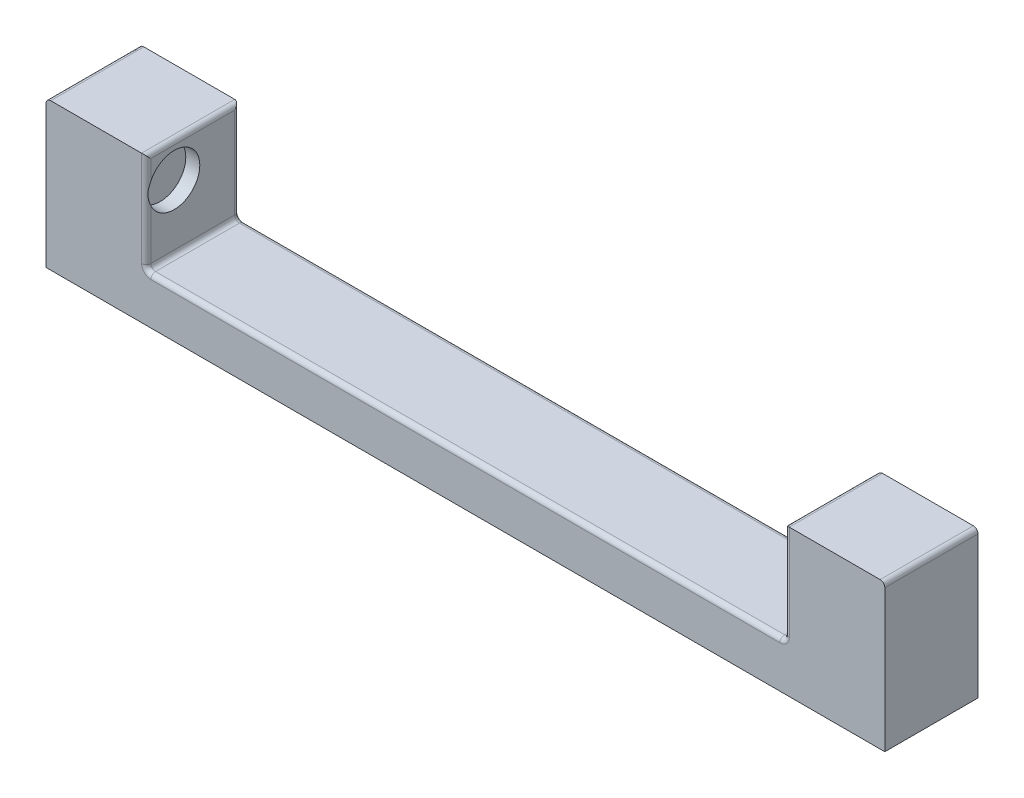
ISO-10303-21;
HEADER;
FILE_DESCRIPTION(('STEP AP214'),'2;1');
FILE_NAME('part.step','',(''),(''),'','','');
FILE_SCHEMA(('AUTOMOTIVE_DESIGN { 1 0 10303 214 1 1 1 1 }'));
ENDSEC;
DATA;
#1=APPLICATION_CONTEXT('core data for automotive mechanical design processes');
#2=APPLICATION_PROTOCOL_DEFINITION('international standard','automotive_design',2000,#1);
#3=PRODUCT_CONTEXT('',#1,'mechanical');
#4=PRODUCT('Part','Part','',(#3));
#5=PRODUCT_RELATED_PRODUCT_CATEGORY('part','',(#4));
#6=PRODUCT_DEFINITION_FORMATION('','',#4);
#7=PRODUCT_DEFINITION_CONTEXT('part definition',#1,'design');
#8=PRODUCT_DEFINITION('design','',#6,#7);
#9=PRODUCT_DEFINITION_SHAPE('','',#8);
#10=(LENGTH_UNIT() NAMED_UNIT(*) SI_UNIT(.MILLI.,.METRE.));
#11=(NAMED_UNIT(*) PLANE_ANGLE_UNIT() SI_UNIT($,.RADIAN.));
#12=(NAMED_UNIT(*) SI_UNIT($,.STERADIAN.) SOLID_ANGLE_UNIT());
#13=UNCERTAINTY_MEASURE_WITH_UNIT(LENGTH_MEASURE(1.E-05),#10,'distance_accuracy_value','');
#14=(GEOMETRIC_REPRESENTATION_CONTEXT(3) GLOBAL_UNCERTAINTY_ASSIGNED_CONTEXT((#13)) GLOBAL_UNIT_ASSIGNED_CONTEXT((#10,
#11,#12)) REPRESENTATION_CONTEXT('',''));
#15=CARTESIAN_POINT('',(0.,0.,0.));
#16=DIRECTION('',(0.,0.,1.));
#17=DIRECTION('',(1.,0.,0.));
#18=AXIS2_PLACEMENT_3D('',#15,#16,#17);
#19=CARTESIAN_POINT('',(0.,0.,0.));
#20=DIRECTION('',(0.,-1.,0.));
#21=DIRECTION('',(1.,0.,0.));
#22=AXIS2_PLACEMENT_3D('',#19,#20,#21);
#23=PLANE('',#22);
#24=DIRECTION('',(-1.,0.,0.));
#25=VECTOR('',#24,1.);
#26=CARTESIAN_POINT('',(0.,0.,9.5));
#27=LINE('',#26,#25);
#28=CARTESIAN_POINT('',(-33.75,0.,9.5));
#29=VERTEX_POINT('',#28);
#30=CARTESIAN_POINT('',(33.75,0.,9.5));
#31=VERTEX_POINT('',#30);
#32=EDGE_CURVE('E56',#29,#31,#27,.F.);
#33=ORIENTED_EDGE('',*,*,#32,.T.);
#34=DIRECTION('',(0.,0.,-1.));
#35=VECTOR('',#34,1.);
#36=CARTESIAN_POINT('',(33.75,0.,0.));
#37=LINE('',#36,#35);
#38=CARTESIAN_POINT('',(33.75,0.,0.5));
#39=VERTEX_POINT('',#38);
#40=EDGE_CURVE('E51',#31,#39,#37,.T.);
#41=ORIENTED_EDGE('',*,*,#40,.T.);
#42=DIRECTION('',(1.,0.,0.));
#43=VECTOR('',#42,1.);
#44=CARTESIAN_POINT('',(-34.25,0.,0.5));
#45=LINE('',#44,#43);
#46=CARTESIAN_POINT('',(-33.75,0.,0.5));
#47=VERTEX_POINT('',#46);
#48=EDGE_CURVE('E448',#39,#47,#45,.F.);
#49=ORIENTED_EDGE('',*,*,#48,.T.);
#50=DIRECTION('',(0.,0.,-1.));
#51=VECTOR('',#50,1.);
#52=CARTESIAN_POINT('',(-33.75,0.,10.));
#53=LINE('',#52,#51);
#54=EDGE_CURVE('E450',#47,#29,#53,.F.);
#55=ORIENTED_EDGE('',*,*,#54,.T.);
#56=EDGE_LOOP('',(#33,#41,#49,#55));
#57=FACE_BOUND('',#56,.T.);
#58=ADVANCED_FACE('F34',(#57),#23,.F.);
#59=CARTESIAN_POINT('',(-34.25,10.75,10.));
#60=DIRECTION('',(-1.,0.,0.));
#61=DIRECTION('',(0.,0.,1.));
#62=AXIS2_PLACEMENT_3D('',#59,#60,#61);
#63=PLANE('',#62);
#64=DIRECTION('',(0.,0.,-1.));
#65=VECTOR('',#64,1.);
#66=CARTESIAN_POINT('',(-34.25,10.25,10.));
#67=LINE('',#66,#65);
#68=CARTESIAN_POINT('',(-34.25,10.25,0.5));
#69=VERTEX_POINT('',#68);
#70=CARTESIAN_POINT('',(-34.25,10.25,9.5));
#71=VERTEX_POINT('',#70);
#72=EDGE_CURVE('E225',#69,#71,#67,.F.);
#73=ORIENTED_EDGE('',*,*,#72,.T.);
#74=DIRECTION('',(0.,1.,0.));
#75=VECTOR('',#74,1.);
#76=CARTESIAN_POINT('',(-34.25,10.75,9.5));
#77=LINE('',#76,#75);
#78=CARTESIAN_POINT('',(-34.25,8.14564392373896,9.5));
#79=VERTEX_POINT('',#78);
#80=EDGE_CURVE('E227',#71,#79,#77,.F.);
#81=ORIENTED_EDGE('',*,*,#80,.T.);
#82=CARTESIAN_POINT('',(-34.25,7.,7.));
#83=DIRECTION('',(1.,0.,0.));
#84=DIRECTION('',(0.,0.,-1.));
#85=AXIS2_PLACEMENT_3D('',#82,#83,#84);
#86=CIRCLE('',#85,2.75);
#87=CARTESIAN_POINT('',(-34.25,5.85435607626104,9.5));
#88=VERTEX_POINT('',#87);
#89=EDGE_CURVE('E457',#88,#79,#86,.T.);
#90=ORIENTED_EDGE('',*,*,#89,.F.);
#91=DIRECTION('',(0.,1.,0.));
#92=VECTOR('',#91,1.);
#93=CARTESIAN_POINT('',(-34.25,10.75,9.5));
#94=LINE('',#93,#92);
#95=CARTESIAN_POINT('',(-34.25,0.499999999999997,9.5));
#96=VERTEX_POINT('',#95);
#97=EDGE_CURVE('E220',#88,#96,#94,.F.);
#98=ORIENTED_EDGE('',*,*,#97,.T.);
#99=DIRECTION('',(0.,0.,-1.));
#100=VECTOR('',#99,1.);
#101=CARTESIAN_POINT('',(-34.25,0.499999999999997,0.));
#102=LINE('',#101,#100);
#103=CARTESIAN_POINT('',(-34.25,0.499999999999997,0.5));
#104=VERTEX_POINT('',#103);
#105=EDGE_CURVE('E216',#96,#104,#102,.T.);
#106=ORIENTED_EDGE('',*,*,#105,.T.);
#107=DIRECTION('',(0.,1.,0.));
#108=VECTOR('',#107,1.);
#109=CARTESIAN_POINT('',(-34.25,10.75,0.5));
#110=LINE('',#109,#108);
#111=EDGE_CURVE('E222',#104,#69,#110,.T.);
#112=ORIENTED_EDGE('',*,*,#111,.T.);
#113=EDGE_LOOP('',(#73,#81,#90,#98,#106,#112));
#114=FACE_BOUND('',#113,.T.);
#115=ADVANCED_FACE('F315',(#114),#63,.F.);
#116=CARTESIAN_POINT('',(-34.25,10.75,10.));
#117=DIRECTION('',(0.,-1.,0.));
#118=DIRECTION('',(1.,0.,0.));
#119=AXIS2_PLACEMENT_3D('',#116,#117,#118);
#120=PLANE('',#119);
#121=DIRECTION('',(-1.,0.,0.));
#122=VECTOR('',#121,1.);
#123=CARTESIAN_POINT('',(-34.25,10.75,0.));
#124=LINE('',#123,#122);
#125=CARTESIAN_POINT('',(-34.75,10.75,0.));
#126=VERTEX_POINT('',#125);
#127=CARTESIAN_POINT('',(-44.5,10.75,0.));
#128=VERTEX_POINT('',#127);
#129=EDGE_CURVE('E183',#126,#128,#124,.T.);
#130=ORIENTED_EDGE('',*,*,#129,.T.);
#131=DIRECTION('',(0.,0.,-1.));
#132=VECTOR('',#131,1.);
#133=CARTESIAN_POINT('',(-44.5,10.75,10.));
#134=LINE('',#133,#132);
#135=CARTESIAN_POINT('',(-44.5,10.75,10.));
#136=VERTEX_POINT('',#135);
#137=EDGE_CURVE('E11',#128,#136,#134,.F.);
#138=ORIENTED_EDGE('',*,*,#137,.T.);
#139=DIRECTION('',(-1.,0.,0.));
#140=VECTOR('',#139,1.);
#141=CARTESIAN_POINT('',(-34.25,10.75,10.));
#142=LINE('',#141,#140);
#143=CARTESIAN_POINT('',(-34.75,10.75,10.));
#144=VERTEX_POINT('',#143);
#145=EDGE_CURVE('E182',#144,#136,#142,.T.);
#146=ORIENTED_EDGE('',*,*,#145,.F.);
#147=DIRECTION('',(0.,0.,-1.));
#148=VECTOR('',#147,1.);
#149=CARTESIAN_POINT('',(-34.75,10.75,10.));
#150=LINE('',#149,#148);
#151=EDGE_CURVE('E43',#144,#126,#150,.T.);
#152=ORIENTED_EDGE('',*,*,#151,.T.);
#153=EDGE_LOOP('',(#130,#138,#146,#152));
#154=FACE_BOUND('',#153,.T.);
#155=ADVANCED_FACE('F320',(#154),#120,.F.);
#156=CARTESIAN_POINT('',(-45.,10.75,10.));
#157=DIRECTION('',(1.,0.,0.));
#158=DIRECTION('',(0.,0.,-1.));
#159=AXIS2_PLACEMENT_3D('',#156,#157,#158);
#160=PLANE('',#159);
#161=DIRECTION('',(0.,-1.,0.));
#162=VECTOR('',#161,1.);
#163=CARTESIAN_POINT('',(-45.,10.75,10.));
#164=LINE('',#163,#162);
#165=CARTESIAN_POINT('',(-45.,10.25,10.));
#166=VERTEX_POINT('',#165);
#167=CARTESIAN_POINT('',(-45.,-5.00000000000001,10.));
#168=VERTEX_POINT('',#167);
#169=EDGE_CURVE('E214',#166,#168,#164,.T.);
#170=ORIENTED_EDGE('',*,*,#169,.F.);
#171=DIRECTION('',(0.,0.,-1.));
#172=VECTOR('',#171,1.);
#173=CARTESIAN_POINT('',(-45.,10.25,10.));
#174=LINE('',#173,#172);
#175=CARTESIAN_POINT('',(-45.,10.25,0.));
#176=VERTEX_POINT('',#175);
#177=EDGE_CURVE('E180',#166,#176,#174,.T.);
#178=ORIENTED_EDGE('',*,*,#177,.T.);
#179=DIRECTION('',(0.,-1.,0.));
#180=VECTOR('',#179,1.);
#181=CARTESIAN_POINT('',(-45.,10.75,0.));
#182=LINE('',#181,#180);
#183=CARTESIAN_POINT('',(-45.,-5.00000000000001,0.));
#184=VERTEX_POINT('',#183);
#185=EDGE_CURVE('E173',#176,#184,#182,.T.);
#186=ORIENTED_EDGE('',*,*,#185,.T.);
#187=DIRECTION('',(0.,0.,-1.));
#188=VECTOR('',#187,1.);
#189=CARTESIAN_POINT('',(-45.,-5.00000000000001,10.));
#190=LINE('',#189,#188);
#191=EDGE_CURVE('E178',#168,#184,#190,.T.);
#192=ORIENTED_EDGE('',*,*,#191,.F.);
#193=EDGE_LOOP('',(#170,#178,#186,#192));
#194=FACE_BOUND('',#193,.T.);
#195=ADVANCED_FACE('F176',(#194),#160,.F.);
#196=CARTESIAN_POINT('',(0.,0.,10.));
#197=DIRECTION('',(0.,0.,-1.));
#198=DIRECTION('',(-1.,0.,0.));
#199=AXIS2_PLACEMENT_3D('',#196,#197,#198);
#200=PLANE('',#199);
#201=DIRECTION('',(-1.,0.,0.));
#202=VECTOR('',#201,1.);
#203=CARTESIAN_POINT('',(34.25,10.75,10.));
#204=LINE('',#203,#202);
#205=CARTESIAN_POINT('',(44.5,10.75,10.));
#206=VERTEX_POINT('',#205);
#207=CARTESIAN_POINT('',(34.75,10.75,10.));
#208=VERTEX_POINT('',#207);
#209=EDGE_CURVE('E199',#206,#208,#204,.T.);
#210=ORIENTED_EDGE('',*,*,#209,.T.);
#211=DIRECTION('',(0.,-1.,0.));
#212=VECTOR('',#211,1.);
#213=CARTESIAN_POINT('',(34.75,0.,10.));
#214=LINE('',#213,#212);
#215=CARTESIAN_POINT('',(34.75,0.500000000000004,10.));
#216=VERTEX_POINT('',#215);
#217=EDGE_CURVE('E271',#208,#216,#214,.T.);
#218=ORIENTED_EDGE('',*,*,#217,.T.);
#219=CARTESIAN_POINT('',(33.75,0.500000000000004,10.));
#220=DIRECTION('',(0.,0.,-1.));
#221=DIRECTION('',(-1.,0.,0.));
#222=AXIS2_PLACEMENT_3D('',#219,#220,#221);
#223=CIRCLE('',#222,1.);
#224=CARTESIAN_POINT('',(33.75,-0.499999999999996,10.));
#225=VERTEX_POINT('',#224);
#226=EDGE_CURVE('E268',#225,#216,#223,.F.);
#227=ORIENTED_EDGE('',*,*,#226,.F.);
#228=DIRECTION('',(-1.,0.,0.));
#229=VECTOR('',#228,1.);
#230=CARTESIAN_POINT('',(0.,-0.5,10.));
#231=LINE('',#230,#229);
#232=CARTESIAN_POINT('',(-33.75,-0.500000000000004,10.));
#233=VERTEX_POINT('',#232);
#234=EDGE_CURVE('E264',#225,#233,#231,.T.);
#235=ORIENTED_EDGE('',*,*,#234,.T.);
#236=CARTESIAN_POINT('',(-33.75,0.499999999999997,10.));
#237=DIRECTION('',(0.,0.,-1.));
#238=DIRECTION('',(-1.,0.,0.));
#239=AXIS2_PLACEMENT_3D('',#236,#237,#238);
#240=CIRCLE('',#239,1.);
#241=CARTESIAN_POINT('',(-34.75,0.499999999999997,10.));
#242=VERTEX_POINT('',#241);
#243=EDGE_CURVE('E261',#242,#233,#240,.F.);
#244=ORIENTED_EDGE('',*,*,#243,.F.);
#245=DIRECTION('',(0.,1.,0.));
#246=VECTOR('',#245,1.);
#247=CARTESIAN_POINT('',(-34.75,0.,10.));
#248=LINE('',#247,#246);
#249=EDGE_CURVE('E266',#242,#144,#248,.T.);
#250=ORIENTED_EDGE('',*,*,#249,.T.);
#251=ORIENTED_EDGE('',*,*,#145,.T.);
#252=CARTESIAN_POINT('',(-44.5,10.25,10.));
#253=DIRECTION('',(0.,0.,-1.));
#254=DIRECTION('',(-1.,0.,0.));
#255=AXIS2_PLACEMENT_3D('',#252,#253,#254);
#256=CIRCLE('',#255,0.5);
#257=EDGE_CURVE('E257',#136,#166,#256,.F.);
#258=ORIENTED_EDGE('',*,*,#257,.T.);
#259=ORIENTED_EDGE('',*,*,#169,.T.);
#260=DIRECTION('',(-1.,0.,0.));
#261=VECTOR('',#260,1.);
#262=CARTESIAN_POINT('',(-45.,-5.00000000000001,10.));
#263=LINE('',#262,#261);
#264=CARTESIAN_POINT('',(45.,-4.99999999999999,10.));
#265=VERTEX_POINT('',#264);
#266=EDGE_CURVE('E198',#265,#168,#263,.T.);
#267=ORIENTED_EDGE('',*,*,#266,.F.);
#268=DIRECTION('',(0.,1.,0.));
#269=VECTOR('',#268,1.);
#270=CARTESIAN_POINT('',(45.,-4.99999999999999,10.));
#271=LINE('',#270,#269);
#272=CARTESIAN_POINT('',(45.,10.25,10.));
#273=VERTEX_POINT('',#272);
#274=EDGE_CURVE('E208',#265,#273,#271,.T.);
#275=ORIENTED_EDGE('',*,*,#274,.T.);
#276=CARTESIAN_POINT('',(44.5,10.25,10.));
#277=DIRECTION('',(0.,0.,-1.));
#278=DIRECTION('',(-1.,0.,0.));
#279=AXIS2_PLACEMENT_3D('',#276,#277,#278);
#280=CIRCLE('',#279,0.5);
#281=EDGE_CURVE('E259',#273,#206,#280,.F.);
#282=ORIENTED_EDGE('',*,*,#281,.T.);
#283=EDGE_LOOP('',(#210,#218,#227,#235,#244,#250,#251,#258,#259,#267,#275,#282));
#284=FACE_BOUND('',#283,.T.);
#285=ADVANCED_FACE('F330',(#284),#200,.F.);
#286=CARTESIAN_POINT('',(0.,0.,0.));
#287=DIRECTION('',(0.,0.,-1.));
#288=DIRECTION('',(-1.,0.,0.));
#289=AXIS2_PLACEMENT_3D('',#286,#287,#288);
#290=PLANE('',#289);
#291=ORIENTED_EDGE('',*,*,#129,.F.);
#292=DIRECTION('',(0.,1.,0.));
#293=VECTOR('',#292,1.);
#294=CARTESIAN_POINT('',(-34.75,0.,0.));
#295=LINE('',#294,#293);
#296=CARTESIAN_POINT('',(-34.75,0.499999999999997,0.));
#297=VERTEX_POINT('',#296);
#298=EDGE_CURVE('E243',#126,#297,#295,.F.);
#299=ORIENTED_EDGE('',*,*,#298,.T.);
#300=CARTESIAN_POINT('',(-33.75,0.499999999999997,0.));
#301=DIRECTION('',(0.,0.,-1.));
#302=DIRECTION('',(-1.,0.,0.));
#303=AXIS2_PLACEMENT_3D('',#300,#301,#302);
#304=CIRCLE('',#303,1.);
#305=CARTESIAN_POINT('',(-33.75,-0.500000000000004,0.));
#306=VERTEX_POINT('',#305);
#307=EDGE_CURVE('E240',#306,#297,#304,.T.);
#308=ORIENTED_EDGE('',*,*,#307,.F.);
#309=DIRECTION('',(1.,0.,0.));
#310=VECTOR('',#309,1.);
#311=CARTESIAN_POINT('',(34.25,-0.499999999999996,0.));
#312=LINE('',#311,#310);
#313=CARTESIAN_POINT('',(33.75,-0.499999999999996,0.));
#314=VERTEX_POINT('',#313);
#315=EDGE_CURVE('E236',#306,#314,#312,.T.);
#316=ORIENTED_EDGE('',*,*,#315,.T.);
#317=CARTESIAN_POINT('',(33.75,0.500000000000004,0.));
#318=DIRECTION('',(0.,0.,-1.));
#319=DIRECTION('',(-1.,0.,0.));
#320=AXIS2_PLACEMENT_3D('',#317,#318,#319);
#321=CIRCLE('',#320,1.);
#322=CARTESIAN_POINT('',(34.75,0.500000000000004,0.));
#323=VERTEX_POINT('',#322);
#324=EDGE_CURVE('E233',#323,#314,#321,.T.);
#325=ORIENTED_EDGE('',*,*,#324,.F.);
#326=DIRECTION('',(0.,-1.,0.));
#327=VECTOR('',#326,1.);
#328=CARTESIAN_POINT('',(34.75,10.75,0.));
#329=LINE('',#328,#327);
#330=CARTESIAN_POINT('',(34.75,10.75,0.));
#331=VERTEX_POINT('',#330);
#332=EDGE_CURVE('E238',#323,#331,#329,.F.);
#333=ORIENTED_EDGE('',*,*,#332,.T.);
#334=DIRECTION('',(-1.,0.,0.));
#335=VECTOR('',#334,1.);
#336=CARTESIAN_POINT('',(34.25,10.75,0.));
#337=LINE('',#336,#335);
#338=CARTESIAN_POINT('',(44.5,10.75,0.));
#339=VERTEX_POINT('',#338);
#340=EDGE_CURVE('E202',#339,#331,#337,.T.);
#341=ORIENTED_EDGE('',*,*,#340,.F.);
#342=CARTESIAN_POINT('',(44.5,10.25,0.));
#343=DIRECTION('',(0.,0.,-1.));
#344=DIRECTION('',(-1.,0.,0.));
#345=AXIS2_PLACEMENT_3D('',#342,#343,#344);
#346=CIRCLE('',#345,0.5);
#347=CARTESIAN_POINT('',(45.,10.25,0.));
#348=VERTEX_POINT('',#347);
#349=EDGE_CURVE('E231',#339,#348,#346,.T.);
#350=ORIENTED_EDGE('',*,*,#349,.T.);
#351=DIRECTION('',(0.,1.,0.));
#352=VECTOR('',#351,1.);
#353=CARTESIAN_POINT('',(45.,-4.99999999999999,0.));
#354=LINE('',#353,#352);
#355=CARTESIAN_POINT('',(45.,-4.99999999999999,0.));
#356=VERTEX_POINT('',#355);
#357=EDGE_CURVE('E190',#356,#348,#354,.T.);
#358=ORIENTED_EDGE('',*,*,#357,.F.);
#359=DIRECTION('',(1.,0.,0.));
#360=VECTOR('',#359,1.);
#361=CARTESIAN_POINT('',(-45.,-5.00000000000001,0.));
#362=LINE('',#361,#360);
#363=EDGE_CURVE('E186',#184,#356,#362,.T.);
#364=ORIENTED_EDGE('',*,*,#363,.F.);
#365=ORIENTED_EDGE('',*,*,#185,.F.);
#366=CARTESIAN_POINT('',(-44.5,10.25,0.));
#367=DIRECTION('',(0.,0.,-1.));
#368=DIRECTION('',(-1.,0.,0.));
#369=AXIS2_PLACEMENT_3D('',#366,#367,#368);
#370=CIRCLE('',#369,0.5);
#371=EDGE_CURVE('E229',#176,#128,#370,.T.);
#372=ORIENTED_EDGE('',*,*,#371,.T.);
#373=EDGE_LOOP('',(#291,#299,#308,#316,#325,#333,#341,#350,#358,#364,#365,#372));
#374=FACE_BOUND('',#373,.T.);
#375=ADVANCED_FACE('F188',(#374),#290,.T.);
#376=CARTESIAN_POINT('',(45.,-4.99999999999999,10.));
#377=DIRECTION('',(-1.,0.,0.));
#378=DIRECTION('',(0.,-1.,0.));
#379=AXIS2_PLACEMENT_3D('',#376,#377,#378);
#380=PLANE('',#379);
#381=ORIENTED_EDGE('',*,*,#357,.T.);
#382=DIRECTION('',(0.,0.,-1.));
#383=VECTOR('',#382,1.);
#384=CARTESIAN_POINT('',(45.,10.25,10.));
#385=LINE('',#384,#383);
#386=EDGE_CURVE('E440',#348,#273,#385,.F.);
#387=ORIENTED_EDGE('',*,*,#386,.T.);
#388=ORIENTED_EDGE('',*,*,#274,.F.);
#389=DIRECTION('',(0.,0.,1.));
#390=VECTOR('',#389,1.);
#391=CARTESIAN_POINT('',(45.,-4.99999999999999,10.));
#392=LINE('',#391,#390);
#393=EDGE_CURVE('E193',#356,#265,#392,.T.);
#394=ORIENTED_EDGE('',*,*,#393,.F.);
#395=EDGE_LOOP('',(#381,#387,#388,#394));
#396=FACE_BOUND('',#395,.T.);
#397=ADVANCED_FACE('F326',(#396),#380,.F.);
#398=CARTESIAN_POINT('',(0.,-5.,0.));
#399=DIRECTION('',(0.,-1.,0.));
#400=DIRECTION('',(1.,0.,0.));
#401=AXIS2_PLACEMENT_3D('',#398,#399,#400);
#402=PLANE('',#401);
#403=ORIENTED_EDGE('',*,*,#191,.T.);
#404=ORIENTED_EDGE('',*,*,#363,.T.);
#405=ORIENTED_EDGE('',*,*,#393,.T.);
#406=ORIENTED_EDGE('',*,*,#266,.T.);
#407=EDGE_LOOP('',(#403,#404,#405,#406));
#408=FACE_BOUND('',#407,.T.);
#409=ADVANCED_FACE('F196',(#408),#402,.T.);
#410=CARTESIAN_POINT('',(34.25,10.75,10.));
#411=DIRECTION('',(1.,0.,0.));
#412=DIRECTION('',(0.,0.,-1.));
#413=AXIS2_PLACEMENT_3D('',#410,#411,#412);
#414=PLANE('',#413);
#415=CARTESIAN_POINT('',(34.25,7.,7.));
#416=DIRECTION('',(1.,0.,0.));
#417=DIRECTION('',(0.,0.,-1.));
#418=AXIS2_PLACEMENT_3D('',#415,#416,#417);
#419=CIRCLE('',#418,2.75);
#420=CARTESIAN_POINT('',(34.25,5.85435607626104,9.5));
#421=VERTEX_POINT('',#420);
#422=CARTESIAN_POINT('',(34.25,8.14564392373896,9.5));
#423=VERTEX_POINT('',#422);
#424=EDGE_CURVE('E402',#421,#423,#419,.T.);
#425=ORIENTED_EDGE('',*,*,#424,.T.);
#426=DIRECTION('',(0.,-1.,0.));
#427=VECTOR('',#426,1.);
#428=CARTESIAN_POINT('',(34.25,10.75,9.5));
#429=LINE('',#428,#427);
#430=CARTESIAN_POINT('',(34.25,10.25,9.5));
#431=VERTEX_POINT('',#430);
#432=EDGE_CURVE('E255',#423,#431,#429,.F.);
#433=ORIENTED_EDGE('',*,*,#432,.T.);
#434=DIRECTION('',(0.,0.,-1.));
#435=VECTOR('',#434,1.);
#436=CARTESIAN_POINT('',(34.25,10.25,10.));
#437=LINE('',#436,#435);
#438=CARTESIAN_POINT('',(34.25,10.25,0.5));
#439=VERTEX_POINT('',#438);
#440=EDGE_CURVE('E253',#431,#439,#437,.T.);
#441=ORIENTED_EDGE('',*,*,#440,.T.);
#442=DIRECTION('',(0.,-1.,0.));
#443=VECTOR('',#442,1.);
#444=CARTESIAN_POINT('',(34.25,0.,0.5));
#445=LINE('',#444,#443);
#446=CARTESIAN_POINT('',(34.25,0.500000000000004,0.5));
#447=VERTEX_POINT('',#446);
#448=EDGE_CURVE('E250',#439,#447,#445,.T.);
#449=ORIENTED_EDGE('',*,*,#448,.T.);
#450=DIRECTION('',(0.,0.,-1.));
#451=VECTOR('',#450,1.);
#452=CARTESIAN_POINT('',(34.25,0.500000000000004,10.));
#453=LINE('',#452,#451);
#454=CARTESIAN_POINT('',(34.25,0.500000000000004,9.5));
#455=VERTEX_POINT('',#454);
#456=EDGE_CURVE('E246',#447,#455,#453,.F.);
#457=ORIENTED_EDGE('',*,*,#456,.T.);
#458=DIRECTION('',(0.,-1.,0.));
#459=VECTOR('',#458,1.);
#460=CARTESIAN_POINT('',(34.25,10.75,9.5));
#461=LINE('',#460,#459);
#462=EDGE_CURVE('E248',#455,#421,#461,.F.);
#463=ORIENTED_EDGE('',*,*,#462,.T.);
#464=EDGE_LOOP('',(#425,#433,#441,#449,#457,#463));
#465=FACE_BOUND('',#464,.T.);
#466=ADVANCED_FACE('F514',(#465),#414,.F.);
#467=CARTESIAN_POINT('',(34.25,10.75,10.));
#468=DIRECTION('',(0.,-1.,0.));
#469=DIRECTION('',(1.,0.,0.));
#470=AXIS2_PLACEMENT_3D('',#467,#468,#469);
#471=PLANE('',#470);
#472=ORIENTED_EDGE('',*,*,#209,.F.);
#473=DIRECTION('',(0.,0.,-1.));
#474=VECTOR('',#473,1.);
#475=CARTESIAN_POINT('',(44.5,10.75,10.));
#476=LINE('',#475,#474);
#477=EDGE_CURVE('E442',#206,#339,#476,.T.);
#478=ORIENTED_EDGE('',*,*,#477,.T.);
#479=ORIENTED_EDGE('',*,*,#340,.T.);
#480=DIRECTION('',(0.,0.,-1.));
#481=VECTOR('',#480,1.);
#482=CARTESIAN_POINT('',(34.75,10.75,10.));
#483=LINE('',#482,#481);
#484=EDGE_CURVE('E445',#331,#208,#483,.F.);
#485=ORIENTED_EDGE('',*,*,#484,.T.);
#486=EDGE_LOOP('',(#472,#478,#479,#485));
#487=FACE_BOUND('',#486,.T.);
#488=ADVANCED_FACE('F484',(#487),#471,.F.);
#489=CARTESIAN_POINT('',(-35.75,7.,7.));
#490=DIRECTION('',(1.,0.,0.));
#491=DIRECTION('',(0.,0.,-1.));
#492=AXIS2_PLACEMENT_3D('',#489,#490,#491);
#493=CYLINDRICAL_SURFACE('',#492,2.75);
#494=CARTESIAN_POINT('',(-35.75,7.,7.));
#495=DIRECTION('',(1.,0.,0.));
#496=DIRECTION('',(0.,0.,-1.));
#497=AXIS2_PLACEMENT_3D('',#494,#495,#496);
#498=CIRCLE('',#497,2.75);
#499=CARTESIAN_POINT('',(-35.75,7.,4.25));
#500=VERTEX_POINT('',#499);
#501=EDGE_CURVE('E460',#500,#500,#498,.T.);
#502=ORIENTED_EDGE('',*,*,#501,.F.);
#503=EDGE_LOOP('',(#502));
#504=FACE_BOUND('',#503,.T.);
#505=ORIENTED_EDGE('',*,*,#89,.T.);
#506=CARTESIAN_POINT('',(-34.25,8.14564392373896,9.5));
#507=CARTESIAN_POINT('',(-34.2500049626879,8.11397344008742,9.51451371585392));
#508=CARTESIAN_POINT('',(-34.2506312705985,8.08203787357754,9.52841974236252));
#509=CARTESIAN_POINT('',(-34.25285369203,8.01770238795992,9.55499356315604));
#510=CARTESIAN_POINT('',(-34.2544494199749,7.98530265846787,9.56766184741474));
#511=CARTESIAN_POINT('',(-34.2602790553164,7.88752790280845,9.6037702124062));
#512=CARTESIAN_POINT('',(-34.2655564289976,7.8215187380705,9.62534061871106));
#513=CARTESIAN_POINT('',(-34.2770233900492,7.68833961222194,9.66335749949584));
#514=CARTESIAN_POINT('',(-34.2832103822051,7.62117341827058,9.67981814996878));
#515=CARTESIAN_POINT('',(-34.2949056421147,7.48571844813915,9.70764789594498));
#516=CARTESIAN_POINT('',(-34.3004138202098,7.41742952501476,9.71901631938162));
#517=CARTESIAN_POINT('',(-34.3094144326842,7.27981816356622,9.73660882387516));
#518=CARTESIAN_POINT('',(-34.3129001261578,7.21049305009526,9.74281573112369));
#519=CARTESIAN_POINT('',(-34.3169382979361,7.07149292418163,9.74995077685205));
#520=CARTESIAN_POINT('',(-34.3174913959394,7.00181798877633,9.75088003057696));
#521=CARTESIAN_POINT('',(-34.3155212103846,6.8626592365288,9.74745004112598));
#522=CARTESIAN_POINT('',(-34.3129984734169,6.79317538792847,9.74309173757459));
#523=CARTESIAN_POINT('',(-34.3055278279097,6.65486021008916,9.7291413806279));
#524=CARTESIAN_POINT('',(-34.3005793540092,6.58602903678175,9.71954810707098));
#525=CARTESIAN_POINT('',(-34.2903968977527,6.46058685134723,9.69720253262583));
#526=CARTESIAN_POINT('',(-34.2853423954137,6.40382064414649,9.68522488706765));
#527=CARTESIAN_POINT('',(-34.2752988887898,6.29117617966152,9.65771126363303));
#528=CARTESIAN_POINT('',(-34.2703098577133,6.23529755706461,9.6421767925092));
#529=CARTESIAN_POINT('',(-34.2613794214853,6.12453783549194,9.60757177859914));
#530=CARTESIAN_POINT('',(-34.2574381841332,6.06965689760038,9.58850067026552));
#531=CARTESIAN_POINT('',(-34.2517653938801,5.96106054410994,9.54685970840422));
#532=CARTESIAN_POINT('',(-34.2500362799571,5.90734647905366,9.52428602379132));
#533=CARTESIAN_POINT('',(-34.25,5.85435607626104,9.5));
#534=B_SPLINE_CURVE_WITH_KNOTS('',3,(#506,#507,#508,#509,#510,#511,#512,#513,#514,#515,#516,
#517,#518,#519,#520,#521,#522,#523,#524,#525,#526,#527,#528,#529,#530,#531,#532,#533),
.UNSPECIFIED.,.F.,.F.,(4,2,2,2,2,2,2,2,2,2,2,2,2,4),(0.,0.10448227829028,0.208923027112628,
0.417611943257084,0.625716609859965,0.833848733805176,1.0426706316498,1.25144840074323,
1.46018907445145,1.66897842202321,1.84357420734434,2.01809616629749,2.19264605734341,
2.36738823309053),.UNSPECIFIED.);
#535=EDGE_CURVE('E281',#79,#88,#534,.T.);
#536=ORIENTED_EDGE('',*,*,#535,.T.);
#537=EDGE_LOOP('',(#505,#536));
#538=FACE_BOUND('',#537,.T.);
#539=ADVANCED_FACE('F456',(#504,#538),#493,.F.);
#540=CARTESIAN_POINT('',(-35.75,7.,7.));
#541=DIRECTION('',(1.,0.,0.));
#542=DIRECTION('',(0.,0.,-1.));
#543=AXIS2_PLACEMENT_3D('',#540,#541,#542);
#544=PLANE('',#543);
#545=ORIENTED_EDGE('',*,*,#501,.T.);
#546=EDGE_LOOP('',(#545));
#547=FACE_BOUND('',#546,.T.);
#548=ADVANCED_FACE('F503',(#547),#544,.T.);
#549=CARTESIAN_POINT('',(35.75,7.,7.));
#550=DIRECTION('',(-1.,0.,0.));
#551=DIRECTION('',(0.,0.,1.));
#552=AXIS2_PLACEMENT_3D('',#549,#550,#551);
#553=CYLINDRICAL_SURFACE('',#552,2.75);
#554=CARTESIAN_POINT('',(35.75,7.,7.));
#555=DIRECTION('',(1.,0.,0.));
#556=DIRECTION('',(0.,0.,-1.));
#557=AXIS2_PLACEMENT_3D('',#554,#555,#556);
#558=CIRCLE('',#557,2.75);
#559=CARTESIAN_POINT('',(35.75,7.,4.25));
#560=VERTEX_POINT('',#559);
#561=EDGE_CURVE('E461',#560,#560,#558,.T.);
#562=ORIENTED_EDGE('',*,*,#561,.T.);
#563=EDGE_LOOP('',(#562));
#564=FACE_BOUND('',#563,.T.);
#565=ORIENTED_EDGE('',*,*,#424,.F.);
#566=CARTESIAN_POINT('',(34.25,5.85435607626104,9.5));
#567=CARTESIAN_POINT('',(34.2500049626879,5.88602655991257,9.51451371585392));
#568=CARTESIAN_POINT('',(34.2506312705985,5.91796212642245,9.52841974236252));
#569=CARTESIAN_POINT('',(34.25285369203,5.98229761204007,9.55499356315604));
#570=CARTESIAN_POINT('',(34.2544494199749,6.01469734153213,9.56766184741474));
#571=CARTESIAN_POINT('',(34.2602790553164,6.11247209719154,9.6037702124062));
#572=CARTESIAN_POINT('',(34.2655564289976,6.17848126192949,9.62534061871106));
#573=CARTESIAN_POINT('',(34.2770233900492,6.31166038777805,9.66335749949584));
#574=CARTESIAN_POINT('',(34.2832103822051,6.37882658172941,9.67981814996878));
#575=CARTESIAN_POINT('',(34.2949056421147,6.51428155186083,9.70764789594498));
#576=CARTESIAN_POINT('',(34.3004138202098,6.58257047498523,9.71901631938162));
#577=CARTESIAN_POINT('',(34.3094144326842,6.72018183643377,9.73660882387516));
#578=CARTESIAN_POINT('',(34.3129001261578,6.78950694990474,9.74281573112369));
#579=CARTESIAN_POINT('',(34.3169382979361,6.92850707581836,9.74995077685205));
#580=CARTESIAN_POINT('',(34.3174913959394,6.99818201122366,9.75088003057696));
#581=CARTESIAN_POINT('',(34.3155212103846,7.13734076347119,9.74745004112598));
#582=CARTESIAN_POINT('',(34.3129984734169,7.20682461207152,9.74309173757459));
#583=CARTESIAN_POINT('',(34.3055278279097,7.34513978991083,9.7291413806279));
#584=CARTESIAN_POINT('',(34.3005793540092,7.41397096321824,9.71954810707098));
#585=CARTESIAN_POINT('',(34.2903968977527,7.53941314865276,9.69720253262583));
#586=CARTESIAN_POINT('',(34.2853423954137,7.5961793558535,9.68522488706765));
#587=CARTESIAN_POINT('',(34.2752988887898,7.70882382033847,9.65771126363303));
#588=CARTESIAN_POINT('',(34.2703098577133,7.76470244293539,9.6421767925092));
#589=CARTESIAN_POINT('',(34.2613794214853,7.87546216450805,9.60757177859914));
#590=CARTESIAN_POINT('',(34.2574381841332,7.93034310239961,9.58850067026552));
#591=CARTESIAN_POINT('',(34.2517653938801,8.03893945589006,9.54685970840422));
#592=CARTESIAN_POINT('',(34.2500362799571,8.09265352094634,9.52428602379132));
#593=CARTESIAN_POINT('',(34.25,8.14564392373896,9.5));
#594=B_SPLINE_CURVE_WITH_KNOTS('',3,(#566,#567,#568,#569,#570,#571,#572,#573,#574,#575,#576,
#577,#578,#579,#580,#581,#582,#583,#584,#585,#586,#587,#588,#589,#590,#591,#592,#593),
.UNSPECIFIED.,.F.,.F.,(4,2,2,2,2,2,2,2,2,2,2,2,2,4),(0.,0.10448227829028,0.208923027112628,
0.417611943257084,0.625716609859963,0.833848733805176,1.0426706316498,1.25144840074323,
1.46018907445145,1.66897842202321,1.84357420734434,2.01809616629749,2.19264605734341,
2.36738823309053),.UNSPECIFIED.);
#595=EDGE_CURVE('E273',#421,#423,#594,.T.);
#596=ORIENTED_EDGE('',*,*,#595,.T.);
#597=EDGE_LOOP('',(#565,#596));
#598=FACE_BOUND('',#597,.T.);
#599=ADVANCED_FACE('F289',(#564,#598),#553,.F.);
#600=CARTESIAN_POINT('',(35.75,7.,7.));
#601=DIRECTION('',(-1.,0.,0.));
#602=DIRECTION('',(0.,0.,-1.));
#603=AXIS2_PLACEMENT_3D('',#600,#601,#602);
#604=PLANE('',#603);
#605=ORIENTED_EDGE('',*,*,#561,.F.);
#606=EDGE_LOOP('',(#605));
#607=FACE_BOUND('',#606,.T.);
#608=ADVANCED_FACE('F298',(#607),#604,.T.);
#609=CARTESIAN_POINT('',(34.75,0.,9.5));
#610=DIRECTION('',(0.,-1.,0.));
#611=DIRECTION('',(0.,0.,-1.));
#612=AXIS2_PLACEMENT_3D('',#609,#610,#611);
#613=CYLINDRICAL_SURFACE('',#612,0.5);
#614=CARTESIAN_POINT('',(34.75,0.500000000000004,9.5));
#615=DIRECTION('',(0.,-1.,0.));
#616=DIRECTION('',(0.,0.,-1.));
#617=AXIS2_PLACEMENT_3D('',#614,#615,#616);
#618=CIRCLE('',#617,0.5);
#619=EDGE_CURVE('E390',#216,#455,#618,.T.);
#620=ORIENTED_EDGE('',*,*,#619,.F.);
#621=ORIENTED_EDGE('',*,*,#217,.F.);
#622=CARTESIAN_POINT('',(34.75,10.25,9.5));
#623=DIRECTION('',(0.,0.707106781186547,-0.707106781186547));
#624=DIRECTION('',(0.,-0.707106781186547,-0.707106781186547));
#625=AXIS2_PLACEMENT_3D('',#622,#623,#624);
#626=ELLIPSE('',#625,0.707106781186547,0.5);
#627=EDGE_CURVE('E38',#431,#208,#626,.T.);
#628=ORIENTED_EDGE('',*,*,#627,.F.);
#629=ORIENTED_EDGE('',*,*,#432,.F.);
#630=ORIENTED_EDGE('',*,*,#595,.F.);
#631=ORIENTED_EDGE('',*,*,#462,.F.);
#632=EDGE_LOOP('',(#620,#621,#628,#629,#630,#631));
#633=FACE_BOUND('',#632,.T.);
#634=ADVANCED_FACE('F293',(#633),#613,.T.);
#635=CARTESIAN_POINT('',(34.75,10.25,10.));
#636=DIRECTION('',(0.,0.,-1.));
#637=DIRECTION('',(-1.,0.,0.));
#638=AXIS2_PLACEMENT_3D('',#635,#636,#637);
#639=CYLINDRICAL_SURFACE('',#638,0.5);
#640=ORIENTED_EDGE('',*,*,#627,.T.);
#641=ORIENTED_EDGE('',*,*,#484,.F.);
#642=CARTESIAN_POINT('',(34.75,10.25,0.5));
#643=DIRECTION('',(0.,-0.707106781186547,-0.707106781186547));
#644=DIRECTION('',(0.,0.707106781186547,-0.707106781186547));
#645=AXIS2_PLACEMENT_3D('',#642,#643,#644);
#646=ELLIPSE('',#645,0.707106781186547,0.5);
#647=EDGE_CURVE('E401',#439,#331,#646,.T.);
#648=ORIENTED_EDGE('',*,*,#647,.F.);
#649=ORIENTED_EDGE('',*,*,#440,.F.);
#650=EDGE_LOOP('',(#640,#641,#648,#649));
#651=FACE_BOUND('',#650,.T.);
#652=ADVANCED_FACE('F297',(#651),#639,.T.);
#653=CARTESIAN_POINT('',(33.75,0.500000000000004,9.5));
#654=DIRECTION('',(0.,0.,-1.));
#655=DIRECTION('',(-1.,0.,0.));
#656=AXIS2_PLACEMENT_3D('',#653,#654,#655);
#657=TOROIDAL_SURFACE('',#656,1.,0.5);
#658=ORIENTED_EDGE('',*,*,#226,.T.);
#659=ORIENTED_EDGE('',*,*,#619,.T.);
#660=CARTESIAN_POINT('',(33.75,0.500000000000004,9.5));
#661=DIRECTION('',(0.,0.,-1.));
#662=DIRECTION('',(-1.,0.,0.));
#663=AXIS2_PLACEMENT_3D('',#660,#661,#662);
#664=CIRCLE('',#663,0.5);
#665=EDGE_CURVE('E404',#31,#455,#664,.F.);
#666=ORIENTED_EDGE('',*,*,#665,.F.);
#667=CARTESIAN_POINT('',(33.75,-0.499999999999996,9.5));
#668=DIRECTION('',(1.,0.,0.));
#669=DIRECTION('',(0.,0.,-1.));
#670=AXIS2_PLACEMENT_3D('',#667,#668,#669);
#671=CIRCLE('',#670,0.5);
#672=EDGE_CURVE('E392',#225,#31,#671,.F.);
#673=ORIENTED_EDGE('',*,*,#672,.F.);
#674=EDGE_LOOP('',(#658,#659,#666,#673));
#675=FACE_BOUND('',#674,.T.);
#676=ADVANCED_FACE('F378',(#675),#657,.T.);
#677=CARTESIAN_POINT('',(34.75,10.75,0.5));
#678=DIRECTION('',(0.,1.,0.));
#679=DIRECTION('',(0.,0.,1.));
#680=AXIS2_PLACEMENT_3D('',#677,#678,#679);
#681=CYLINDRICAL_SURFACE('',#680,0.5);
#682=ORIENTED_EDGE('',*,*,#647,.T.);
#683=ORIENTED_EDGE('',*,*,#332,.F.);
#684=CARTESIAN_POINT('',(34.75,0.500000000000004,0.5));
#685=DIRECTION('',(0.,-1.,0.));
#686=DIRECTION('',(0.,0.,-1.));
#687=AXIS2_PLACEMENT_3D('',#684,#685,#686);
#688=CIRCLE('',#687,0.5);
#689=EDGE_CURVE('E409',#447,#323,#688,.T.);
#690=ORIENTED_EDGE('',*,*,#689,.F.);
#691=ORIENTED_EDGE('',*,*,#448,.F.);
#692=EDGE_LOOP('',(#682,#683,#690,#691));
#693=FACE_BOUND('',#692,.T.);
#694=ADVANCED_FACE('F375',(#693),#681,.T.);
#695=CARTESIAN_POINT('',(33.75,0.500000000000004,0.));
#696=DIRECTION('',(0.,0.,1.));
#697=DIRECTION('',(1.,0.,0.));
#698=AXIS2_PLACEMENT_3D('',#695,#696,#697);
#699=CYLINDRICAL_SURFACE('',#698,0.5);
#700=ORIENTED_EDGE('',*,*,#665,.T.);
#701=ORIENTED_EDGE('',*,*,#456,.F.);
#702=CARTESIAN_POINT('',(33.75,0.500000000000004,0.5));
#703=DIRECTION('',(0.,0.,-1.));
#704=DIRECTION('',(-1.,0.,0.));
#705=AXIS2_PLACEMENT_3D('',#702,#703,#704);
#706=CIRCLE('',#705,0.5);
#707=EDGE_CURVE('E412',#39,#447,#706,.F.);
#708=ORIENTED_EDGE('',*,*,#707,.F.);
#709=ORIENTED_EDGE('',*,*,#40,.F.);
#710=EDGE_LOOP('',(#700,#701,#708,#709));
#711=FACE_BOUND('',#710,.T.);
#712=ADVANCED_FACE('F371',(#711),#699,.F.);
#713=CARTESIAN_POINT('',(0.,-0.5,9.5));
#714=DIRECTION('',(-1.,0.,0.));
#715=DIRECTION('',(0.,-1.,0.));
#716=AXIS2_PLACEMENT_3D('',#713,#714,#715);
#717=CYLINDRICAL_SURFACE('',#716,0.5);
#718=ORIENTED_EDGE('',*,*,#672,.T.);
#719=ORIENTED_EDGE('',*,*,#32,.F.);
#720=CARTESIAN_POINT('',(-33.75,-0.500000000000004,9.5));
#721=DIRECTION('',(-1.,0.,0.));
#722=DIRECTION('',(0.,0.,1.));
#723=AXIS2_PLACEMENT_3D('',#720,#721,#722);
#724=CIRCLE('',#723,0.5);
#725=EDGE_CURVE('E414',#233,#29,#724,.T.);
#726=ORIENTED_EDGE('',*,*,#725,.F.);
#727=ORIENTED_EDGE('',*,*,#234,.F.);
#728=EDGE_LOOP('',(#718,#719,#726,#727));
#729=FACE_BOUND('',#728,.T.);
#730=ADVANCED_FACE('F367',(#729),#717,.T.);
#731=CARTESIAN_POINT('',(33.75,0.500000000000004,0.5));
#732=DIRECTION('',(0.,0.,-1.));
#733=DIRECTION('',(-1.,0.,0.));
#734=AXIS2_PLACEMENT_3D('',#731,#732,#733);
#735=TOROIDAL_SURFACE('',#734,1.,0.5);
#736=ORIENTED_EDGE('',*,*,#689,.T.);
#737=ORIENTED_EDGE('',*,*,#324,.T.);
#738=CARTESIAN_POINT('',(33.75,-0.499999999999996,0.5));
#739=DIRECTION('',(1.,0.,0.));
#740=DIRECTION('',(0.,0.,-1.));
#741=AXIS2_PLACEMENT_3D('',#738,#739,#740);
#742=CIRCLE('',#741,0.5);
#743=EDGE_CURVE('E417',#39,#314,#742,.F.);
#744=ORIENTED_EDGE('',*,*,#743,.F.);
#745=ORIENTED_EDGE('',*,*,#707,.T.);
#746=EDGE_LOOP('',(#736,#737,#744,#745));
#747=FACE_BOUND('',#746,.T.);
#748=ADVANCED_FACE('F363',(#747),#735,.T.);
#749=CARTESIAN_POINT('',(-33.75,0.499999999999997,9.5));
#750=DIRECTION('',(0.,0.,-1.));
#751=DIRECTION('',(-1.,0.,0.));
#752=AXIS2_PLACEMENT_3D('',#749,#750,#751);
#753=TOROIDAL_SURFACE('',#752,1.,0.5);
#754=ORIENTED_EDGE('',*,*,#243,.T.);
#755=ORIENTED_EDGE('',*,*,#725,.T.);
#756=CARTESIAN_POINT('',(-33.75,0.499999999999997,9.5));
#757=DIRECTION('',(0.,0.,-1.));
#758=DIRECTION('',(-1.,0.,0.));
#759=AXIS2_PLACEMENT_3D('',#756,#757,#758);
#760=CIRCLE('',#759,0.5);
#761=EDGE_CURVE('E420',#96,#29,#760,.F.);
#762=ORIENTED_EDGE('',*,*,#761,.F.);
#763=CARTESIAN_POINT('',(-34.75,0.499999999999997,9.5));
#764=DIRECTION('',(0.,-1.,0.));
#765=DIRECTION('',(0.,0.,-1.));
#766=AXIS2_PLACEMENT_3D('',#763,#764,#765);
#767=CIRCLE('',#766,0.5);
#768=EDGE_CURVE('E423',#242,#96,#767,.F.);
#769=ORIENTED_EDGE('',*,*,#768,.F.);
#770=EDGE_LOOP('',(#754,#755,#762,#769));
#771=FACE_BOUND('',#770,.T.);
#772=ADVANCED_FACE('F359',(#771),#753,.T.);
#773=CARTESIAN_POINT('',(0.,-0.5,0.5));
#774=DIRECTION('',(-1.,0.,0.));
#775=DIRECTION('',(0.,-1.,0.));
#776=AXIS2_PLACEMENT_3D('',#773,#774,#775);
#777=CYLINDRICAL_SURFACE('',#776,0.5);
#778=ORIENTED_EDGE('',*,*,#743,.T.);
#779=ORIENTED_EDGE('',*,*,#315,.F.);
#780=CARTESIAN_POINT('',(-33.75,-0.500000000000004,0.5));
#781=DIRECTION('',(-1.,0.,0.));
#782=DIRECTION('',(0.,0.,1.));
#783=AXIS2_PLACEMENT_3D('',#780,#781,#782);
#784=CIRCLE('',#783,0.5);
#785=EDGE_CURVE('E426',#47,#306,#784,.T.);
#786=ORIENTED_EDGE('',*,*,#785,.F.);
#787=ORIENTED_EDGE('',*,*,#48,.F.);
#788=EDGE_LOOP('',(#778,#779,#786,#787));
#789=FACE_BOUND('',#788,.T.);
#790=ADVANCED_FACE('F355',(#789),#777,.T.);
#791=CARTESIAN_POINT('',(-33.75,0.499999999999997,10.));
#792=DIRECTION('',(0.,0.,1.));
#793=DIRECTION('',(1.,0.,0.));
#794=AXIS2_PLACEMENT_3D('',#791,#792,#793);
#795=CYLINDRICAL_SURFACE('',#794,0.5);
#796=ORIENTED_EDGE('',*,*,#761,.T.);
#797=ORIENTED_EDGE('',*,*,#54,.F.);
#798=CARTESIAN_POINT('',(-33.75,0.499999999999997,0.5));
#799=DIRECTION('',(0.,0.,-1.));
#800=DIRECTION('',(-1.,0.,0.));
#801=AXIS2_PLACEMENT_3D('',#798,#799,#800);
#802=CIRCLE('',#801,0.5);
#803=EDGE_CURVE('E429',#104,#47,#802,.F.);
#804=ORIENTED_EDGE('',*,*,#803,.F.);
#805=ORIENTED_EDGE('',*,*,#105,.F.);
#806=EDGE_LOOP('',(#796,#797,#804,#805));
#807=FACE_BOUND('',#806,.T.);
#808=ADVANCED_FACE('F351',(#807),#795,.F.);
#809=CARTESIAN_POINT('',(-34.75,0.,9.5));
#810=DIRECTION('',(0.,1.,0.));
#811=DIRECTION('',(0.,0.,1.));
#812=AXIS2_PLACEMENT_3D('',#809,#810,#811);
#813=CYLINDRICAL_SURFACE('',#812,0.5);
#814=ORIENTED_EDGE('',*,*,#535,.F.);
#815=ORIENTED_EDGE('',*,*,#80,.F.);
#816=CARTESIAN_POINT('',(-34.75,10.25,9.5));
#817=DIRECTION('',(0.,0.707106781186547,-0.707106781186547));
#818=DIRECTION('',(0.,-0.707106781186547,-0.707106781186547));
#819=AXIS2_PLACEMENT_3D('',#816,#817,#818);
#820=ELLIPSE('',#819,0.707106781186547,0.5);
#821=EDGE_CURVE('E431',#144,#71,#820,.T.);
#822=ORIENTED_EDGE('',*,*,#821,.F.);
#823=ORIENTED_EDGE('',*,*,#249,.F.);
#824=ORIENTED_EDGE('',*,*,#768,.T.);
#825=ORIENTED_EDGE('',*,*,#97,.F.);
#826=EDGE_LOOP('',(#814,#815,#822,#823,#824,#825));
#827=FACE_BOUND('',#826,.T.);
#828=ADVANCED_FACE('F346',(#827),#813,.T.);
#829=CARTESIAN_POINT('',(-33.75,0.499999999999997,0.5));
#830=DIRECTION('',(0.,0.,-1.));
#831=DIRECTION('',(-1.,0.,0.));
#832=AXIS2_PLACEMENT_3D('',#829,#830,#831);
#833=TOROIDAL_SURFACE('',#832,1.,0.5);
#834=ORIENTED_EDGE('',*,*,#785,.T.);
#835=ORIENTED_EDGE('',*,*,#307,.T.);
#836=CARTESIAN_POINT('',(-34.75,0.499999999999997,0.5));
#837=DIRECTION('',(0.,-1.,0.));
#838=DIRECTION('',(0.,0.,-1.));
#839=AXIS2_PLACEMENT_3D('',#836,#837,#838);
#840=CIRCLE('',#839,0.5);
#841=EDGE_CURVE('E434',#104,#297,#840,.F.);
#842=ORIENTED_EDGE('',*,*,#841,.F.);
#843=ORIENTED_EDGE('',*,*,#803,.T.);
#844=EDGE_LOOP('',(#834,#835,#842,#843));
#845=FACE_BOUND('',#844,.T.);
#846=ADVANCED_FACE('F343',(#845),#833,.T.);
#847=CARTESIAN_POINT('',(-34.75,10.25,10.));
#848=DIRECTION('',(0.,0.,-1.));
#849=DIRECTION('',(-1.,0.,0.));
#850=AXIS2_PLACEMENT_3D('',#847,#848,#849);
#851=CYLINDRICAL_SURFACE('',#850,0.5);
#852=ORIENTED_EDGE('',*,*,#821,.T.);
#853=ORIENTED_EDGE('',*,*,#72,.F.);
#854=CARTESIAN_POINT('',(-34.75,10.25,0.5));
#855=DIRECTION('',(0.,-0.707106781186547,-0.707106781186547));
#856=DIRECTION('',(0.,0.707106781186547,-0.707106781186547));
#857=AXIS2_PLACEMENT_3D('',#854,#855,#856);
#858=ELLIPSE('',#857,0.707106781186547,0.5);
#859=EDGE_CURVE('E436',#126,#69,#858,.T.);
#860=ORIENTED_EDGE('',*,*,#859,.F.);
#861=ORIENTED_EDGE('',*,*,#151,.F.);
#862=EDGE_LOOP('',(#852,#853,#860,#861));
#863=FACE_BOUND('',#862,.T.);
#864=ADVANCED_FACE('F310',(#863),#851,.T.);
#865=CARTESIAN_POINT('',(-34.75,10.75,0.5));
#866=DIRECTION('',(0.,-1.,0.));
#867=DIRECTION('',(0.,0.,-1.));
#868=AXIS2_PLACEMENT_3D('',#865,#866,#867);
#869=CYLINDRICAL_SURFACE('',#868,0.5);
#870=ORIENTED_EDGE('',*,*,#841,.T.);
#871=ORIENTED_EDGE('',*,*,#298,.F.);
#872=ORIENTED_EDGE('',*,*,#859,.T.);
#873=ORIENTED_EDGE('',*,*,#111,.F.);
#874=EDGE_LOOP('',(#870,#871,#872,#873));
#875=FACE_BOUND('',#874,.T.);
#876=ADVANCED_FACE('F303',(#875),#869,.T.);
#877=CARTESIAN_POINT('',(44.5,10.25,10.));
#878=DIRECTION('',(0.,0.,-1.));
#879=DIRECTION('',(-1.,0.,0.));
#880=AXIS2_PLACEMENT_3D('',#877,#878,#879);
#881=CYLINDRICAL_SURFACE('',#880,0.5);
#882=ORIENTED_EDGE('',*,*,#281,.F.);
#883=ORIENTED_EDGE('',*,*,#386,.F.);
#884=ORIENTED_EDGE('',*,*,#349,.F.);
#885=ORIENTED_EDGE('',*,*,#477,.F.);
#886=EDGE_LOOP('',(#882,#883,#884,#885));
#887=FACE_BOUND('',#886,.T.);
#888=ADVANCED_FACE('F301',(#887),#881,.T.);
#889=CARTESIAN_POINT('',(-44.5,10.25,10.));
#890=DIRECTION('',(0.,0.,-1.));
#891=DIRECTION('',(-1.,0.,0.));
#892=AXIS2_PLACEMENT_3D('',#889,#890,#891);
#893=CYLINDRICAL_SURFACE('',#892,0.5);
#894=ORIENTED_EDGE('',*,*,#257,.F.);
#895=ORIENTED_EDGE('',*,*,#137,.F.);
#896=ORIENTED_EDGE('',*,*,#371,.F.);
#897=ORIENTED_EDGE('',*,*,#177,.F.);
#898=EDGE_LOOP('',(#894,#895,#896,#897));
#899=FACE_BOUND('',#898,.T.);
#900=ADVANCED_FACE('F36',(#899),#893,.T.);
#901=CLOSED_SHELL('',(#58,#115,#155,#195,#285,#375,#397,#409,#466,#488,#539,#548,#599,#608,#634,
#652,#676,#694,#712,#730,#748,#772,#790,#808,#828,#846,#864,#876,#888,#900));
#902=MANIFOLD_SOLID_BREP('B2',#901);
#903=ADVANCED_BREP_SHAPE_REPRESENTATION('',(#18,#902),#14);
#904=SHAPE_DEFINITION_REPRESENTATION(#9,#903);
ENDSEC;
END-ISO-10303-21;
